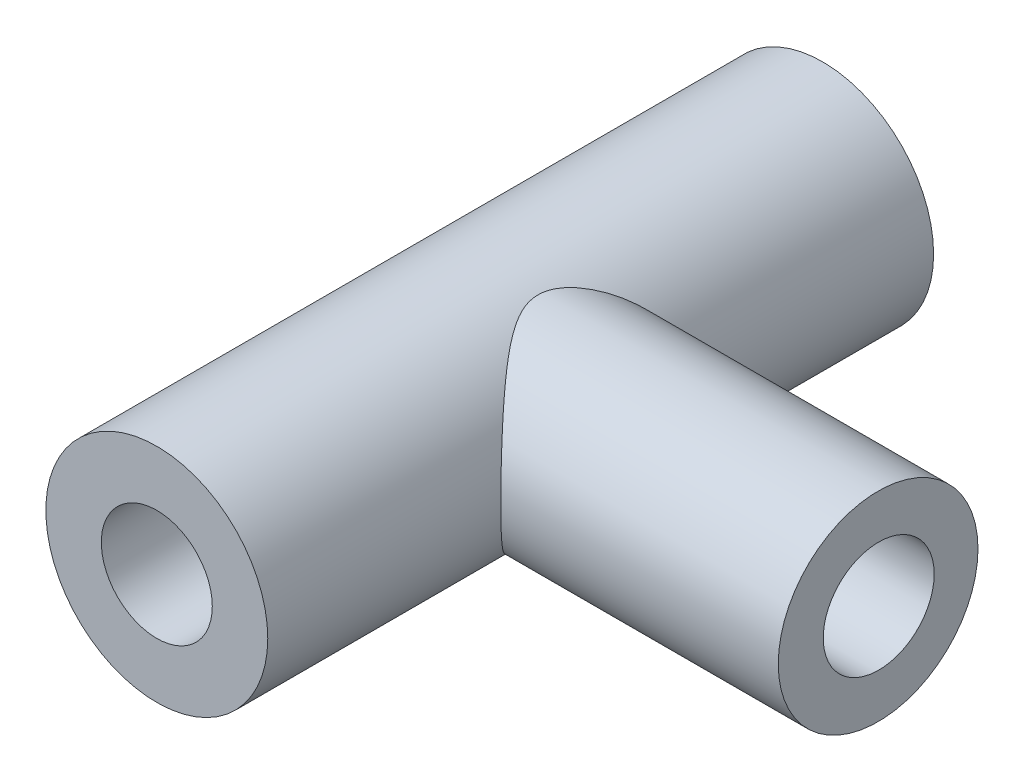
ISO-10303-21;
HEADER;
FILE_DESCRIPTION(('STEP AP214'),'2;1');
FILE_NAME('part.step','',(''),(''),'','','');
FILE_SCHEMA(('AUTOMOTIVE_DESIGN { 1 0 10303 214 1 1 1 1 }'));
ENDSEC;
DATA;
#1=APPLICATION_CONTEXT('core data for automotive mechanical design processes');
#2=APPLICATION_PROTOCOL_DEFINITION('international standard','automotive_design',2000,#1);
#3=PRODUCT_CONTEXT('',#1,'mechanical');
#4=PRODUCT('Part','Part','',(#3));
#5=PRODUCT_RELATED_PRODUCT_CATEGORY('part','',(#4));
#6=PRODUCT_DEFINITION_FORMATION('','',#4);
#7=PRODUCT_DEFINITION_CONTEXT('part definition',#1,'design');
#8=PRODUCT_DEFINITION('design','',#6,#7);
#9=PRODUCT_DEFINITION_SHAPE('','',#8);
#10=(LENGTH_UNIT() NAMED_UNIT(*) SI_UNIT(.MILLI.,.METRE.));
#11=(NAMED_UNIT(*) PLANE_ANGLE_UNIT() SI_UNIT($,.RADIAN.));
#12=(NAMED_UNIT(*) SI_UNIT($,.STERADIAN.) SOLID_ANGLE_UNIT());
#13=UNCERTAINTY_MEASURE_WITH_UNIT(LENGTH_MEASURE(1.E-05),#10,'distance_accuracy_value','');
#14=(GEOMETRIC_REPRESENTATION_CONTEXT(3) GLOBAL_UNCERTAINTY_ASSIGNED_CONTEXT((#13)) GLOBAL_UNIT_ASSIGNED_CONTEXT((#10,
#11,#12)) REPRESENTATION_CONTEXT('',''));
#15=CARTESIAN_POINT('',(0.,0.,0.));
#16=DIRECTION('',(0.,0.,1.));
#17=DIRECTION('',(1.,0.,0.));
#18=AXIS2_PLACEMENT_3D('',#15,#16,#17);
#19=CARTESIAN_POINT('',(0.,0.,60.));
#20=DIRECTION('',(0.,0.,1.));
#21=DIRECTION('',(1.,0.,0.));
#22=AXIS2_PLACEMENT_3D('',#19,#20,#21);
#23=PLANE('',#22);
#24=CARTESIAN_POINT('',(0.,0.,60.));
#25=DIRECTION('',(0.,0.,1.));
#26=DIRECTION('',(1.,0.,0.));
#27=AXIS2_PLACEMENT_3D('',#24,#25,#26);
#28=CIRCLE('',#27,10.);
#29=CARTESIAN_POINT('',(10.,0.,60.));
#30=VERTEX_POINT('',#29);
#31=EDGE_CURVE('E12',#30,#30,#28,.T.);
#32=ORIENTED_EDGE('',*,*,#31,.T.);
#33=EDGE_LOOP('',(#32));
#34=FACE_BOUND('',#33,.T.);
#35=CARTESIAN_POINT('',(0.,0.,60.));
#36=DIRECTION('',(0.,0.,1.));
#37=DIRECTION('',(1.,0.,0.));
#38=AXIS2_PLACEMENT_3D('',#35,#36,#37);
#39=CIRCLE('',#38,5.);
#40=CARTESIAN_POINT('',(5.,0.,60.));
#41=VERTEX_POINT('',#40);
#42=EDGE_CURVE('E110',#41,#41,#39,.T.);
#43=ORIENTED_EDGE('',*,*,#42,.F.);
#44=EDGE_LOOP('',(#43));
#45=FACE_BOUND('',#44,.T.);
#46=ADVANCED_FACE('F43',(#34,#45),#23,.T.);
#47=CARTESIAN_POINT('',(0.,0.,0.));
#48=DIRECTION('',(0.,0.,1.));
#49=DIRECTION('',(1.,0.,0.));
#50=AXIS2_PLACEMENT_3D('',#47,#48,#49);
#51=PLANE('',#50);
#52=CARTESIAN_POINT('',(0.,0.,0.));
#53=DIRECTION('',(0.,0.,1.));
#54=DIRECTION('',(1.,0.,0.));
#55=AXIS2_PLACEMENT_3D('',#52,#53,#54);
#56=CIRCLE('',#55,10.);
#57=CARTESIAN_POINT('',(10.,0.,0.));
#58=VERTEX_POINT('',#57);
#59=EDGE_CURVE('E47',#58,#58,#56,.T.);
#60=ORIENTED_EDGE('',*,*,#59,.F.);
#61=EDGE_LOOP('',(#60));
#62=FACE_BOUND('',#61,.T.);
#63=CARTESIAN_POINT('',(0.,0.,0.));
#64=DIRECTION('',(0.,0.,1.));
#65=DIRECTION('',(1.,0.,0.));
#66=AXIS2_PLACEMENT_3D('',#63,#64,#65);
#67=CIRCLE('',#66,5.);
#68=CARTESIAN_POINT('',(5.,0.,0.));
#69=VERTEX_POINT('',#68);
#70=EDGE_CURVE('E111',#69,#69,#67,.T.);
#71=ORIENTED_EDGE('',*,*,#70,.T.);
#72=EDGE_LOOP('',(#71));
#73=FACE_BOUND('',#72,.T.);
#74=ADVANCED_FACE('F99',(#62,#73),#51,.F.);
#75=CARTESIAN_POINT('',(0.,0.,60.));
#76=DIRECTION('',(0.,0.,-1.));
#77=DIRECTION('',(-1.,0.,0.));
#78=AXIS2_PLACEMENT_3D('',#75,#76,#77);
#79=CYLINDRICAL_SURFACE('',#78,10.);
#80=CARTESIAN_POINT('',(10.,0.,21.));
#81=CARTESIAN_POINT('',(9.99999822075564,0.208591336139704,21.0000018062206));
#82=CARTESIAN_POINT('',(9.99345913086623,0.417212662518086,21.0072659184795));
#83=CARTESIAN_POINT('',(9.96744804584769,0.832661207683807,21.0361805336653));
#84=CARTESIAN_POINT('',(9.94797353997437,1.0394880702716,21.057833829511));
#85=CARTESIAN_POINT('',(9.89651008951586,1.44978280828922,21.115121252132));
#86=CARTESIAN_POINT('',(9.86451094135946,1.65324780366004,21.1507667781612));
#87=CARTESIAN_POINT('',(9.78868322329511,2.05511559898306,21.2353738811484));
#88=CARTESIAN_POINT('',(9.74485494392981,2.25351852313696,21.2843351310508));
#89=CARTESIAN_POINT('',(9.64656342757218,2.64269381542638,21.3943743139776));
#90=CARTESIAN_POINT('',(9.59217328271416,2.83350834456197,21.4553690147848));
#91=CARTESIAN_POINT('',(9.47351079985787,3.20798902567351,21.5887968996752));
#92=CARTESIAN_POINT('',(9.40923483740394,3.39165252477949,21.6612342792737));
#93=CARTESIAN_POINT('',(9.27183119120367,3.75102008763086,21.816591894266));
#94=CARTESIAN_POINT('',(9.19870427408351,3.92672483891481,21.8995112217927));
#95=CARTESIAN_POINT('',(9.04460325347337,4.26972137041644,22.0749382558574));
#96=CARTESIAN_POINT('',(8.963627388822,4.43701124963942,22.1674481146619));
#97=CARTESIAN_POINT('',(8.76134093541032,4.82747909389426,22.3996369013439));
#98=CARTESIAN_POINT('',(8.63676960177494,5.04651160217782,22.5434729541512));
#99=CARTESIAN_POINT('',(8.37688663382894,5.46707491722489,22.8461027362985));
#100=CARTESIAN_POINT('',(8.24157429825283,5.66860457944946,23.0048974423952));
#101=CARTESIAN_POINT('',(7.96232131270646,6.05461030750053,23.336177524564));
#102=CARTESIAN_POINT('',(7.81836166942883,6.23904638929418,23.5086933289867));
#103=CARTESIAN_POINT('',(7.52447620930473,6.59050254399244,23.865829485315));
#104=CARTESIAN_POINT('',(7.37455117408163,6.75752488824051,24.0504482534533));
#105=CARTESIAN_POINT('',(7.06754873407845,7.07814552332059,24.4354621975794));
#106=CARTESIAN_POINT('',(6.91038607201199,7.23134037452456,24.6361247309182));
#107=CARTESIAN_POINT('',(6.59499148533199,7.52009267554092,25.0490692610472));
#108=CARTESIAN_POINT('',(6.43675928207226,7.65564532683488,25.2613543968676));
#109=CARTESIAN_POINT('',(6.12285610718175,7.90893181209911,25.6974101447493));
#110=CARTESIAN_POINT('',(5.96718102123475,8.02669742678456,25.9211592919081));
#111=CARTESIAN_POINT('',(5.66255963157115,8.24441600858507,26.3813821949684));
#112=CARTESIAN_POINT('',(5.51360906169374,8.34438039114035,26.6178476686293));
#113=CARTESIAN_POINT('',(5.22919653164209,8.52547819361278,27.1045833766424));
#114=CARTESIAN_POINT('',(5.09368870277216,8.60667700144466,27.354801796769));
#115=CARTESIAN_POINT('',(4.84536380095118,8.74887644605377,27.8718592670497));
#116=CARTESIAN_POINT('',(4.73252472001651,8.80989671075502,28.1386818640688));
#117=CARTESIAN_POINT('',(4.56012229347782,8.90018395933437,28.6433352994184));
#118=CARTESIAN_POINT('',(4.49477426632589,8.93307730146587,28.8784292934967));
#119=CARTESIAN_POINT('',(4.42353157948361,8.9684471545365,29.2374727241863));
#120=CARTESIAN_POINT('',(4.40425165248958,8.97790688993239,29.3581288447596));
#121=CARTESIAN_POINT('',(4.37548078679569,8.99196507210535,29.6008612156947));
#122=CARTESIAN_POINT('',(4.36598540280883,8.99656572647064,29.7229367956562));
#123=CARTESIAN_POINT('',(4.3572807971636,9.00078482308246,29.9682368474729));
#124=CARTESIAN_POINT('',(4.35813018590762,9.00037487671021,30.0914639093434));
#125=CARTESIAN_POINT('',(4.37020431200984,8.99451820243078,30.3372820182562));
#126=CARTESIAN_POINT('',(4.38142926836634,8.98907136820943,30.459873051819));
#127=CARTESIAN_POINT('',(4.41366974342865,8.97328463974612,30.7036417550107));
#128=CARTESIAN_POINT('',(4.43470240984558,8.96293617503652,30.8248165666315));
#129=CARTESIAN_POINT('',(4.48554269478811,8.93760089199271,31.0648322690674));
#130=CARTESIAN_POINT('',(4.51535375030515,8.92261225678032,31.1836722262427));
#131=CARTESIAN_POINT('',(4.59691677851816,8.88094865900697,31.4688357717717));
#132=CARTESIAN_POINT('',(4.65259807546762,8.85201778005304,31.6337055047244));
#133=CARTESIAN_POINT('',(4.77582512393043,8.78614640934154,31.9572782148295));
#134=CARTESIAN_POINT('',(4.84337758961673,8.74920138210341,32.1159776397741));
#135=CARTESIAN_POINT('',(4.98751391902558,8.66784693798675,32.4278564348586));
#136=CARTESIAN_POINT('',(5.06412662824179,8.62341347804331,32.5810160306196));
#137=CARTESIAN_POINT('',(5.22380612522446,8.52763429468579,32.8817268974214));
#138=CARTESIAN_POINT('',(5.30687530747094,8.47628600157992,33.029276057245));
#139=CARTESIAN_POINT('',(5.55015590508379,8.32050440191286,33.4426116077224));
#140=CARTESIAN_POINT('',(5.715863013362,8.20807879614437,33.7021759494696));
#141=CARTESIAN_POINT('',(6.05443879499309,7.96164586475166,34.2060478921735));
#142=CARTESIAN_POINT('',(6.22731282928755,7.82762215899412,34.4503437166754));
#143=CARTESIAN_POINT('',(6.57469595738063,7.53820261632412,34.9246991618829));
#144=CARTESIAN_POINT('',(6.74920503666741,7.38280696893126,35.1547589088033));
#145=CARTESIAN_POINT('',(7.09563871657597,7.05049831570232,35.6006908072791));
#146=CARTESIAN_POINT('',(7.2675643828184,6.87359447159645,35.8165689397595));
#147=CARTESIAN_POINT('',(7.58118798687422,6.52475815011973,36.2036543502054));
#148=CARTESIAN_POINT('',(7.72369108919157,6.35573634892167,36.3768335425801));
#149=CARTESIAN_POINT('',(8.00216224874954,6.00134812899357,36.7114231482439));
#150=CARTESIAN_POINT('',(8.13812990841546,5.81598071784015,36.87283284586));
#151=CARTESIAN_POINT('',(8.40113017286144,5.42914605348386,37.1823129764957));
#152=CARTESIAN_POINT('',(8.52817773932508,5.22770703177382,37.3304058689472));
#153=CARTESIAN_POINT('',(8.77130759664048,4.80861735212104,37.6118895669229));
#154=CARTESIAN_POINT('',(8.88739380042,4.59097252923926,37.7452856217026));
#155=CARTESIAN_POINT('',(9.081147137007,4.1916709731594,37.9667689968427));
#156=CARTESIAN_POINT('',(9.1615226026905,4.01319492949247,38.0582344991303));
#157=CARTESIAN_POINT('',(9.31318021395377,3.64744184988087,38.2302474486268));
#158=CARTESIAN_POINT('',(9.38446758106708,3.4601699529768,38.3108011668405));
#159=CARTESIAN_POINT('',(9.51684247787139,3.07745026114665,38.4599925516259));
#160=CARTESIAN_POINT('',(9.5779310254252,2.88200328454768,38.5286314073522));
#161=CARTESIAN_POINT('',(9.68880765505367,2.48388719309487,38.6529639604204));
#162=CARTESIAN_POINT('',(9.73859558378566,2.28121798028276,38.7086574821021));
#163=CARTESIAN_POINT('',(9.82618845578922,1.86838776933374,38.8065009399278));
#164=CARTESIAN_POINT('',(9.86389993543473,1.65818170729513,38.8485452733247));
#165=CARTESIAN_POINT('',(9.9259701344269,1.23336504454426,38.9176855419605));
#166=CARTESIAN_POINT('',(9.95032882113098,1.01875443306585,38.9447814406561));
#167=CARTESIAN_POINT('',(9.98509647395601,0.587115538671983,38.9834416079966));
#168=CARTESIAN_POINT('',(9.99551221721035,0.370088482061626,38.9950134223132));
#169=CARTESIAN_POINT('',(10.0021521117304,-0.0644393537586674,39.0023913520665));
#170=CARTESIAN_POINT('',(9.99837769695784,-0.281940082882569,38.9981990605174));
#171=CARTESIAN_POINT('',(9.97801897753806,-0.689772008273548,38.9755714121752));
#172=CARTESIAN_POINT('',(9.96299793184815,-0.880282250298889,38.958874151062));
#173=CARTESIAN_POINT('',(9.92228210709201,-1.25879179559815,38.9135728617917));
#174=CARTESIAN_POINT('',(9.8965837941991,-1.44679024626886,38.8849648915726));
#175=CARTESIAN_POINT('',(9.83499438417426,-1.81891375108576,38.8163112603646));
#176=CARTESIAN_POINT('',(9.79910648118116,-2.00303999965783,38.7762691836116));
#177=CARTESIAN_POINT('',(9.7177386842764,-2.36648569531645,38.6853242491777));
#178=CARTESIAN_POINT('',(9.67225513650638,-2.54580328194609,38.6344172542344));
#179=CARTESIAN_POINT('',(9.57121366433511,-2.90295140654362,38.521080171789));
#180=CARTESIAN_POINT('',(9.51543921213103,-3.08064176094561,38.4584017694316));
#181=CARTESIAN_POINT('',(9.39542255358045,-3.42929735666787,38.3231563440933));
#182=CARTESIAN_POINT('',(9.33117709421361,-3.60025998150231,38.2505855218799));
#183=CARTESIAN_POINT('',(9.12701393625973,-4.10217969335297,38.0192078430351));
#184=CARTESIAN_POINT('',(8.97562080140166,-4.42233625464522,37.8466815113024));
#185=CARTESIAN_POINT('',(8.69023213252037,-4.95449487331191,37.5183083026827));
#186=CARTESIAN_POINT('',(8.56136290419672,-5.17351361751204,37.3690907316302));
#187=CARTESIAN_POINT('',(8.29297504005046,-5.59362585450987,37.0554961792651));
#188=CARTESIAN_POINT('',(8.15345186303134,-5.79471162339464,36.8911127272793));
#189=CARTESIAN_POINT('',(7.86599388235604,-6.17931687783559,36.548479606848));
#190=CARTESIAN_POINT('',(7.71803815778368,-6.36278934657431,36.3701950078597));
#191=CARTESIAN_POINT('',(7.4165311593164,-6.71179713243088,36.0013525269213));
#192=CARTESIAN_POINT('',(7.26298078560186,-6.87733531829653,35.8107966156747));
#193=CARTESIAN_POINT('',(6.94921785140016,-7.19438934584893,35.4135786092289));
#194=CARTESIAN_POINT('',(6.78893328059214,-7.34549554818447,35.2066470267015));
#195=CARTESIAN_POINT('',(6.46806822077834,-7.62954739619485,34.7807494726201));
#196=CARTESIAN_POINT('',(6.30748764851223,-7.76248673417698,34.5617793580015));
#197=CARTESIAN_POINT('',(5.99014918304625,-8.00989826935301,34.1118514564308));
#198=CARTESIAN_POINT('',(5.83338360045652,-8.12441077650452,33.8809213381464));
#199=CARTESIAN_POINT('',(5.52847437778453,-8.3348778903982,33.40549180992));
#200=CARTESIAN_POINT('',(5.38032376045873,-8.43084766542339,33.1610037031854));
#201=CARTESIAN_POINT('',(5.10799392246123,-8.59840010441478,32.67037218093));
#202=CARTESIAN_POINT('',(4.98293554768521,-8.67104999829591,32.4250935429641));
#203=CARTESIAN_POINT('',(4.75715727069142,-8.79693763612299,31.9187996729557));
#204=CARTESIAN_POINT('',(4.65640221900724,-8.85020347233944,31.6578078581129));
#205=CARTESIAN_POINT('',(4.50642925290166,-8.92738532652371,31.1634301460143));
#206=CARTESIAN_POINT('',(4.45151533114243,-8.95465248090783,30.9323951717102));
#207=CARTESIAN_POINT('',(4.39589492801429,-8.98200944162297,30.5808376987627));
#208=CARTESIAN_POINT('',(4.38181364784923,-8.98887107011242,30.4628896803702));
#209=CARTESIAN_POINT('',(4.36316379599167,-8.99793991816209,30.2260446232584));
#210=CARTESIAN_POINT('',(4.3585947530059,-9.0001473683183,30.10714763185));
#211=CARTESIAN_POINT('',(4.3592354615293,-8.99983697464952,29.8691094398614));
#212=CARTESIAN_POINT('',(4.36446791887893,-8.99730815894548,29.7499683124927));
#213=CARTESIAN_POINT('',(4.38445860746963,-8.98758229591736,29.5126611210543));
#214=CARTESIAN_POINT('',(4.39922095933023,-8.98038322922248,29.3944955011781));
#215=CARTESIAN_POINT('',(4.4568541852798,-8.95200235819511,29.0423978656975));
#216=CARTESIAN_POINT('',(4.51306834714792,-8.92403773985086,28.8111059525907));
#217=CARTESIAN_POINT('',(4.63641842463795,-8.86042898671409,28.4112465798393));
#218=CARTESIAN_POINT('',(4.6981647404199,-8.82797675144782,28.2403748313293));
#219=CARTESIAN_POINT('',(4.83367995297346,-8.75451274164957,27.9052687795977));
#220=CARTESIAN_POINT('',(4.90745682994309,-8.71349528046868,27.7410389730203));
#221=CARTESIAN_POINT('',(5.06398725191419,-8.62346820680021,27.4185377446045));
#222=CARTESIAN_POINT('',(5.14677018693995,-8.57443214795019,27.2602882481096));
#223=CARTESIAN_POINT('',(5.31858899903462,-8.46893187322848,26.9497425951742));
#224=CARTESIAN_POINT('',(5.4076271608198,-8.41246493659045,26.7974486459398));
#225=CARTESIAN_POINT('',(5.6640610460941,-8.24362871059284,26.3767309777984));
#226=CARTESIAN_POINT('',(5.83632991446872,-8.12312293733337,26.1145159101297));
#227=CARTESIAN_POINT('',(6.18676042755216,-7.85953325265835,25.6057074601174));
#228=CARTESIAN_POINT('',(6.36492624145412,-7.71643308514027,25.3591255058205));
#229=CARTESIAN_POINT('',(6.721603848583,-7.40781004299225,24.8808914078531));
#230=CARTESIAN_POINT('',(6.90011544415674,-7.24229754857881,24.649232425511));
#231=CARTESIAN_POINT('',(7.25327826329718,-6.88857102194992,24.2009445496093));
#232=CARTESIAN_POINT('',(7.42793122051627,-6.70036744059597,23.9843088086482));
#233=CARTESIAN_POINT('',(7.73748806524645,-6.33851698802777,23.6064013956577));
#234=CARTESIAN_POINT('',(7.87367585293058,-6.16881992645052,23.4423941637245));
#235=CARTESIAN_POINT('',(8.13920219531019,-5.8139901201316,23.1258426092416));
#236=CARTESIAN_POINT('',(8.26854053950555,-5.62885690144874,22.9732986389257));
#237=CARTESIAN_POINT('',(8.51817197016003,-5.24341439833661,22.6811892782704));
#238=CARTESIAN_POINT('',(8.63847810608496,-5.0431278816093,22.541605092163));
#239=CARTESIAN_POINT('',(8.86813606296874,-4.62736643641262,22.2767764280579));
#240=CARTESIAN_POINT('',(8.97749083091912,-4.41189562074183,22.1515280910079));
#241=CARTESIAN_POINT('',(9.16089675998767,-4.01435379385064,21.9424587634964));
#242=CARTESIAN_POINT('',(9.23747929374947,-3.83508204123307,21.8555247188552));
#243=CARTESIAN_POINT('',(9.38143291653756,-3.46807536598306,21.6926093719557));
#244=CARTESIAN_POINT('',(9.44880600633464,-3.2803422934124,21.6166256905129));
#245=CARTESIAN_POINT('',(9.57318189826344,-2.897357618746,21.4766885359541));
#246=CARTESIAN_POINT('',(9.63019620271232,-2.70211465122906,21.4127217166887));
#247=CARTESIAN_POINT('',(9.73289278003182,-2.3049588511856,21.2977087411515));
#248=CARTESIAN_POINT('',(9.7785774199706,-2.10304742188424,21.246659885928));
#249=CARTESIAN_POINT('',(9.84791950901274,-1.74445232912217,21.1692732788552));
#250=CARTESIAN_POINT('',(9.87423048834956,-1.58891699928702,21.1399463350541));
#251=CARTESIAN_POINT('',(9.91958608261478,-1.27548966832998,21.0894269330371));
#252=CARTESIAN_POINT('',(9.93863157136228,-1.11759795298511,21.0682334966041));
#253=CARTESIAN_POINT('',(9.96921212860522,-0.800150523312334,21.0342180460657));
#254=CARTESIAN_POINT('',(9.98074538356948,-0.640594416621484,21.0213980533944));
#255=CARTESIAN_POINT('',(9.99613918063913,-0.320697997682647,21.0042892506508));
#256=CARTESIAN_POINT('',(10.000001367822,-0.160357860966977,20.9999986114396));
#257=CARTESIAN_POINT('',(10.,0.,21.));
#258=B_SPLINE_CURVE_WITH_KNOTS('',3,(#80,#81,#82,#83,#84,#85,#86,#87,#88,#89,#90,#91,#92,#93,
#94,#95,#96,#97,#98,#99,#100,#101,#102,#103,#104,#105,#106,#107,#108,#109,#110,#111,#112,#113,
#114,#115,#116,#117,#118,#119,#120,#121,#122,#123,#124,#125,#126,#127,#128,#129,#130,#131,#132,
#133,#134,#135,#136,#137,#138,#139,#140,#141,#142,#143,#144,#145,#146,#147,#148,#149,#150,#151,
#152,#153,#154,#155,#156,#157,#158,#159,#160,#161,#162,#163,#164,#165,#166,#167,#168,#169,#170,
#171,#172,#173,#174,#175,#176,#177,#178,#179,#180,#181,#182,#183,#184,#185,#186,#187,#188,#189,
#190,#191,#192,#193,#194,#195,#196,#197,#198,#199,#200,#201,#202,#203,#204,#205,#206,#207,#208,
#209,#210,#211,#212,#213,#214,#215,#216,#217,#218,#219,#220,#221,#222,#223,#224,#225,#226,#227,
#228,#229,#230,#231,#232,#233,#234,#235,#236,#237,#238,#239,#240,#241,#242,#243,#244,#245,#246,
#247,#248,#249,#250,#251,#252,#253,#254,#255,#256,#257),.UNSPECIFIED.,.T.,.F.,(4,2,2,2,2,2,2,2,
2,2,2,2,2,2,2,2,2,2,2,2,2,2,2,2,2,2,2,2,2,2,2,2,2,2,2,2,2,2,2,2,2,2,2,2,2,2,2,2,2,2,2,2,2,2,2,2,
2,2,2,2,2,2,2,2,2,2,2,2,2,2,2,2,2,2,2,2,2,2,2,2,2,2,2,2,2,2,2,2,4),(0.,0.625599569992075,
1.25132060338868,1.87755246357627,2.5037689438935,3.12579700224239,3.74805366193297,
4.3702564633282,4.99259920035767,5.86174188069049,6.73094135292049,7.60212522117006,
8.47319531488766,9.36456070197319,10.2561680279423,11.1461629472878,12.0355850658416,
12.9218596596806,13.8072696096436,14.5428179193646,14.9100463190638,15.2771078068984,
15.6462499187349,16.0153998222739,16.385197578114,16.7551403133437,17.2834681121513,
17.8120956934475,18.3424540504672,18.8730100460837,19.8550160222377,20.8377702934605,
21.8205158504915,22.8028442497725,23.6446119799876,24.4864308533494,25.3268022321223,
26.1668724764833,26.8144552368054,27.4616642377518,28.1088086072678,28.7559617576222,
29.4080087423387,30.0600573210596,30.7117888485995,31.3634545183138,31.9382646879031,
32.5132652526179,33.0880857700774,33.6631255657611,34.252034956617,34.8411711616209,
36.0189002515613,36.9019217884768,37.7853218331211,38.6710180126057,39.5565723072899,
40.4624761651917,41.3686937659057,42.2729011814503,43.1763657783953,44.0290696770353,
44.8805328295965,45.5944542774486,45.9509891435096,46.3075063442749,46.6648504628519,
47.0223491966041,47.7380595231407,48.2910346616418,48.8443781069182,49.3995847880302,
49.9549953229287,50.9617880460392,51.9693084601141,52.976363829394,53.9829571371705,
54.7996924766854,55.6164529019226,56.4320096328727,57.2473463060455,57.8871096525014,
58.5267337873886,59.1656432889699,59.8044191926998,60.2854036536039,60.7663302483515,
61.2473729007822,61.7283123814066),.UNSPECIFIED.);
#259=CARTESIAN_POINT('',(10.,0.,21.));
#260=VERTEX_POINT('',#259);
#261=EDGE_CURVE('E69',#260,#260,#258,.T.);
#262=ORIENTED_EDGE('',*,*,#261,.F.);
#263=EDGE_LOOP('',(#262));
#264=FACE_BOUND('',#263,.T.);
#265=ORIENTED_EDGE('',*,*,#31,.F.);
#266=EDGE_LOOP('',(#265));
#267=FACE_BOUND('',#266,.T.);
#268=ORIENTED_EDGE('',*,*,#59,.T.);
#269=EDGE_LOOP('',(#268));
#270=FACE_BOUND('',#269,.T.);
#271=ADVANCED_FACE('F45',(#264,#267,#270),#79,.T.);
#272=CARTESIAN_POINT('',(0.,0.,60.));
#273=DIRECTION('',(0.,0.,-1.));
#274=DIRECTION('',(-1.,0.,0.));
#275=AXIS2_PLACEMENT_3D('',#272,#273,#274);
#276=CYLINDRICAL_SURFACE('',#275,5.);
#277=CARTESIAN_POINT('',(0.,0.,29.9482532866258));
#278=DIRECTION('',(0.707106781186548,0.,-0.707106781186547));
#279=DIRECTION('',(0.707106781186548,0.,0.707106781186547));
#280=AXIS2_PLACEMENT_3D('',#277,#278,#279);
#281=ELLIPSE('',#280,7.07106781186547,5.);
#282=CARTESIAN_POINT('',(0.,5.,29.9482532866258));
#283=VERTEX_POINT('',#282);
#284=CARTESIAN_POINT('',(0.,-5.,29.9482532866258));
#285=VERTEX_POINT('',#284);
#286=EDGE_CURVE('E57',#283,#285,#281,.T.);
#287=ORIENTED_EDGE('',*,*,#286,.T.);
#288=CARTESIAN_POINT('',(0.,0.,29.9482532866258));
#289=DIRECTION('',(0.707106781186548,0.,0.707106781186547));
#290=DIRECTION('',(0.707106781186548,0.,-0.707106781186547));
#291=AXIS2_PLACEMENT_3D('',#288,#289,#290);
#292=ELLIPSE('',#291,7.07106781186547,5.);
#293=EDGE_CURVE('E59',#285,#283,#292,.T.);
#294=ORIENTED_EDGE('',*,*,#293,.T.);
#295=EDGE_LOOP('',(#287,#294));
#296=FACE_BOUND('',#295,.T.);
#297=ORIENTED_EDGE('',*,*,#42,.T.);
#298=EDGE_LOOP('',(#297));
#299=FACE_BOUND('',#298,.T.);
#300=ORIENTED_EDGE('',*,*,#70,.F.);
#301=EDGE_LOOP('',(#300));
#302=FACE_BOUND('',#301,.T.);
#303=ADVANCED_FACE('F64',(#296,#299,#302),#276,.F.);
#304=CARTESIAN_POINT('',(35.,0.,30.));
#305=DIRECTION('',(1.,0.,0.));
#306=DIRECTION('',(0.,0.,-1.));
#307=AXIS2_PLACEMENT_3D('',#304,#305,#306);
#308=PLANE('',#307);
#309=CARTESIAN_POINT('',(35.,0.,29.9482532866258));
#310=DIRECTION('',(1.,0.,0.));
#311=DIRECTION('',(0.,0.,-1.));
#312=AXIS2_PLACEMENT_3D('',#309,#310,#311);
#313=CIRCLE('',#312,5.);
#314=CARTESIAN_POINT('',(35.,0.,24.9482532866258));
#315=VERTEX_POINT('',#314);
#316=EDGE_CURVE('E66',#315,#315,#313,.T.);
#317=ORIENTED_EDGE('',*,*,#316,.F.);
#318=EDGE_LOOP('',(#317));
#319=FACE_BOUND('',#318,.T.);
#320=CARTESIAN_POINT('',(35.,0.,30.));
#321=DIRECTION('',(1.,0.,0.));
#322=DIRECTION('',(0.,0.,-1.));
#323=AXIS2_PLACEMENT_3D('',#320,#321,#322);
#324=CIRCLE('',#323,9.);
#325=CARTESIAN_POINT('',(35.,0.,21.));
#326=VERTEX_POINT('',#325);
#327=EDGE_CURVE('E79',#326,#326,#324,.T.);
#328=ORIENTED_EDGE('',*,*,#327,.T.);
#329=EDGE_LOOP('',(#328));
#330=FACE_BOUND('',#329,.T.);
#331=ADVANCED_FACE('F87',(#319,#330),#308,.T.);
#332=CARTESIAN_POINT('',(-10.002,0.,30.));
#333=DIRECTION('',(1.,0.,0.));
#334=DIRECTION('',(0.,0.,-1.));
#335=AXIS2_PLACEMENT_3D('',#332,#333,#334);
#336=CYLINDRICAL_SURFACE('',#335,9.);
#337=ORIENTED_EDGE('',*,*,#327,.F.);
#338=EDGE_LOOP('',(#337));
#339=FACE_BOUND('',#338,.T.);
#340=ORIENTED_EDGE('',*,*,#261,.T.);
#341=EDGE_LOOP('',(#340));
#342=FACE_BOUND('',#341,.T.);
#343=ADVANCED_FACE('F81',(#339,#342),#336,.T.);
#344=CARTESIAN_POINT('',(-10.001,0.,29.9482532866258));
#345=DIRECTION('',(1.,0.,0.));
#346=DIRECTION('',(0.,0.,-1.));
#347=AXIS2_PLACEMENT_3D('',#344,#345,#346);
#348=CYLINDRICAL_SURFACE('',#347,5.);
#349=ORIENTED_EDGE('',*,*,#293,.F.);
#350=ORIENTED_EDGE('',*,*,#286,.F.);
#351=EDGE_LOOP('',(#349,#350));
#352=FACE_BOUND('',#351,.T.);
#353=ORIENTED_EDGE('',*,*,#316,.T.);
#354=EDGE_LOOP('',(#353));
#355=FACE_BOUND('',#354,.T.);
#356=ADVANCED_FACE('F60',(#352,#355),#348,.F.);
#357=CLOSED_SHELL('',(#46,#74,#271,#303,#331,#343,#356));
#358=MANIFOLD_SOLID_BREP('B2',#357);
#359=ADVANCED_BREP_SHAPE_REPRESENTATION('',(#18,#358),#14);
#360=SHAPE_DEFINITION_REPRESENTATION(#9,#359);
ENDSEC;
END-ISO-10303-21;
